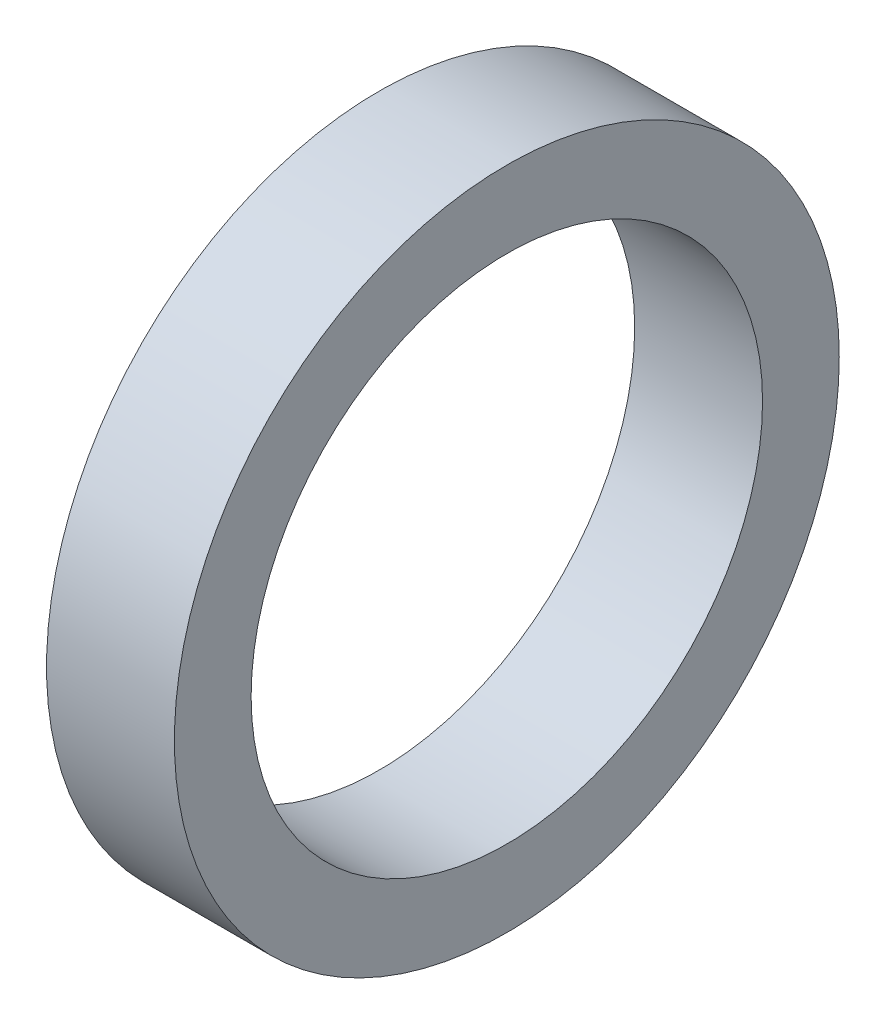
ISO-10303-21;
HEADER;
FILE_DESCRIPTION(('STEP AP214'),'2;1');
FILE_NAME('part.step','',(''),(''),'','','');
FILE_SCHEMA(('AUTOMOTIVE_DESIGN { 1 0 10303 214 1 1 1 1 }'));
ENDSEC;
DATA;
#1=APPLICATION_CONTEXT('core data for automotive mechanical design processes');
#2=APPLICATION_PROTOCOL_DEFINITION('international standard','automotive_design',2000,#1);
#3=PRODUCT_CONTEXT('',#1,'mechanical');
#4=PRODUCT('Part','Part','',(#3));
#5=PRODUCT_RELATED_PRODUCT_CATEGORY('part','',(#4));
#6=PRODUCT_DEFINITION_FORMATION('','',#4);
#7=PRODUCT_DEFINITION_CONTEXT('part definition',#1,'design');
#8=PRODUCT_DEFINITION('design','',#6,#7);
#9=PRODUCT_DEFINITION_SHAPE('','',#8);
#10=(LENGTH_UNIT() NAMED_UNIT(*) SI_UNIT(.MILLI.,.METRE.));
#11=(NAMED_UNIT(*) PLANE_ANGLE_UNIT() SI_UNIT($,.RADIAN.));
#12=(NAMED_UNIT(*) SI_UNIT($,.STERADIAN.) SOLID_ANGLE_UNIT());
#13=UNCERTAINTY_MEASURE_WITH_UNIT(LENGTH_MEASURE(1.E-05),#10,'distance_accuracy_value','');
#14=(GEOMETRIC_REPRESENTATION_CONTEXT(3) GLOBAL_UNCERTAINTY_ASSIGNED_CONTEXT((#13)) GLOBAL_UNIT_ASSIGNED_CONTEXT((#10,
#11,#12)) REPRESENTATION_CONTEXT('',''));
#15=CARTESIAN_POINT('',(0.,0.,0.));
#16=DIRECTION('',(0.,0.,1.));
#17=DIRECTION('',(1.,0.,0.));
#18=AXIS2_PLACEMENT_3D('',#15,#16,#17);
#19=CARTESIAN_POINT('',(0.,0.,0.));
#20=DIRECTION('',(1.,0.,0.));
#21=DIRECTION('',(0.,0.,-1.));
#22=AXIS2_PLACEMENT_3D('',#19,#20,#21);
#23=CYLINDRICAL_SURFACE('',#22,13.);
#24=CARTESIAN_POINT('',(0.,0.,0.));
#25=DIRECTION('',(1.,0.,0.));
#26=DIRECTION('',(0.,0.,-1.));
#27=AXIS2_PLACEMENT_3D('',#24,#25,#26);
#28=CIRCLE('',#27,13.);
#29=CARTESIAN_POINT('',(0.,0.,-13.));
#30=VERTEX_POINT('',#29);
#31=EDGE_CURVE('E10',#30,#30,#28,.T.);
#32=ORIENTED_EDGE('',*,*,#31,.T.);
#33=EDGE_LOOP('',(#32));
#34=FACE_BOUND('',#33,.T.);
#35=CARTESIAN_POINT('',(5.,0.,0.));
#36=DIRECTION('',(1.,0.,0.));
#37=DIRECTION('',(0.,0.,-1.));
#38=AXIS2_PLACEMENT_3D('',#35,#36,#37);
#39=CIRCLE('',#38,13.);
#40=CARTESIAN_POINT('',(5.,0.,-13.));
#41=VERTEX_POINT('',#40);
#42=EDGE_CURVE('E58',#41,#41,#39,.T.);
#43=ORIENTED_EDGE('',*,*,#42,.F.);
#44=EDGE_LOOP('',(#43));
#45=FACE_BOUND('',#44,.T.);
#46=ADVANCED_FACE('F41',(#34,#45),#23,.T.);
#47=CARTESIAN_POINT('',(0.,13.,0.));
#48=DIRECTION('',(-1.,0.,0.));
#49=DIRECTION('',(0.,0.,1.));
#50=AXIS2_PLACEMENT_3D('',#47,#48,#49);
#51=PLANE('',#50);
#52=CARTESIAN_POINT('',(0.,0.,0.));
#53=DIRECTION('',(1.,0.,0.));
#54=DIRECTION('',(0.,0.,-1.));
#55=AXIS2_PLACEMENT_3D('',#52,#53,#54);
#56=CIRCLE('',#55,10.);
#57=CARTESIAN_POINT('',(0.,0.,-10.));
#58=VERTEX_POINT('',#57);
#59=EDGE_CURVE('E48',#58,#58,#56,.T.);
#60=ORIENTED_EDGE('',*,*,#59,.T.);
#61=EDGE_LOOP('',(#60));
#62=FACE_BOUND('',#61,.T.);
#63=ORIENTED_EDGE('',*,*,#31,.F.);
#64=EDGE_LOOP('',(#63));
#65=FACE_BOUND('',#64,.T.);
#66=ADVANCED_FACE('F69',(#62,#65),#51,.T.);
#67=CARTESIAN_POINT('',(0.,0.,0.));
#68=DIRECTION('',(1.,0.,0.));
#69=DIRECTION('',(0.,0.,-1.));
#70=AXIS2_PLACEMENT_3D('',#67,#68,#69);
#71=CYLINDRICAL_SURFACE('',#70,10.);
#72=CARTESIAN_POINT('',(5.,0.,0.));
#73=DIRECTION('',(1.,0.,0.));
#74=DIRECTION('',(0.,0.,-1.));
#75=AXIS2_PLACEMENT_3D('',#72,#73,#74);
#76=CIRCLE('',#75,10.);
#77=CARTESIAN_POINT('',(5.,0.,-10.));
#78=VERTEX_POINT('',#77);
#79=EDGE_CURVE('E53',#78,#78,#76,.T.);
#80=ORIENTED_EDGE('',*,*,#79,.T.);
#81=EDGE_LOOP('',(#80));
#82=FACE_BOUND('',#81,.T.);
#83=ORIENTED_EDGE('',*,*,#59,.F.);
#84=EDGE_LOOP('',(#83));
#85=FACE_BOUND('',#84,.T.);
#86=ADVANCED_FACE('F73',(#82,#85),#71,.F.);
#87=CARTESIAN_POINT('',(5.,10.,0.));
#88=DIRECTION('',(1.,0.,0.));
#89=DIRECTION('',(0.,0.,-1.));
#90=AXIS2_PLACEMENT_3D('',#87,#88,#89);
#91=PLANE('',#90);
#92=ORIENTED_EDGE('',*,*,#42,.T.);
#93=EDGE_LOOP('',(#92));
#94=FACE_BOUND('',#93,.T.);
#95=ORIENTED_EDGE('',*,*,#79,.F.);
#96=EDGE_LOOP('',(#95));
#97=FACE_BOUND('',#96,.T.);
#98=ADVANCED_FACE('F65',(#94,#97),#91,.T.);
#99=CLOSED_SHELL('',(#46,#66,#86,#98));
#100=MANIFOLD_SOLID_BREP('B2',#99);
#101=ADVANCED_BREP_SHAPE_REPRESENTATION('',(#18,#100),#14);
#102=SHAPE_DEFINITION_REPRESENTATION(#9,#101);
ENDSEC;
END-ISO-10303-21;
